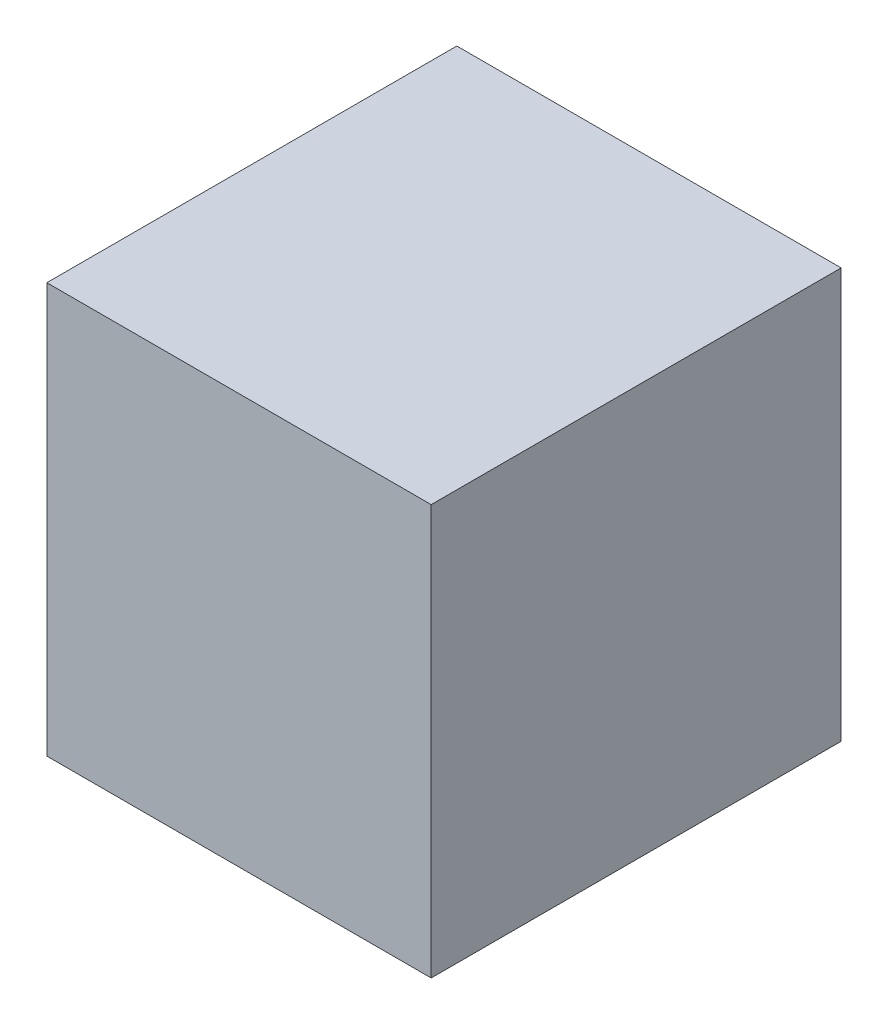
ISO-10303-21;
HEADER;
FILE_DESCRIPTION(('STEP AP214'),'2;1');
FILE_NAME('part.step','',(''),(''),'','','');
FILE_SCHEMA(('AUTOMOTIVE_DESIGN { 1 0 10303 214 1 1 1 1 }'));
ENDSEC;
DATA;
#1=APPLICATION_CONTEXT('core data for automotive mechanical design processes');
#2=APPLICATION_PROTOCOL_DEFINITION('international standard','automotive_design',2000,#1);
#3=PRODUCT_CONTEXT('',#1,'mechanical');
#4=PRODUCT('Part','Part','',(#3));
#5=PRODUCT_RELATED_PRODUCT_CATEGORY('part','',(#4));
#6=PRODUCT_DEFINITION_FORMATION('','',#4);
#7=PRODUCT_DEFINITION_CONTEXT('part definition',#1,'design');
#8=PRODUCT_DEFINITION('design','',#6,#7);
#9=PRODUCT_DEFINITION_SHAPE('','',#8);
#10=(LENGTH_UNIT() NAMED_UNIT(*) SI_UNIT(.MILLI.,.METRE.));
#11=(NAMED_UNIT(*) PLANE_ANGLE_UNIT() SI_UNIT($,.RADIAN.));
#12=(NAMED_UNIT(*) SI_UNIT($,.STERADIAN.) SOLID_ANGLE_UNIT());
#13=UNCERTAINTY_MEASURE_WITH_UNIT(LENGTH_MEASURE(1.E-05),#10,'distance_accuracy_value','');
#14=(GEOMETRIC_REPRESENTATION_CONTEXT(3) GLOBAL_UNCERTAINTY_ASSIGNED_CONTEXT((#13)) GLOBAL_UNIT_ASSIGNED_CONTEXT((#10,
#11,#12)) REPRESENTATION_CONTEXT('',''));
#15=CARTESIAN_POINT('',(0.,0.,0.));
#16=DIRECTION('',(0.,0.,1.));
#17=DIRECTION('',(1.,0.,0.));
#18=AXIS2_PLACEMENT_3D('',#15,#16,#17);
#19=CARTESIAN_POINT('',(143.,-8.,-8.));
#20=DIRECTION('',(-1.,0.,0.));
#21=DIRECTION('',(0.,0.,1.));
#22=AXIS2_PLACEMENT_3D('',#19,#20,#21);
#23=PLANE('',#22);
#24=DIRECTION('',(0.,-1.,0.));
#25=VECTOR('',#24,1.);
#26=CARTESIAN_POINT('',(143.,-8.,8.));
#27=LINE('',#26,#25);
#28=CARTESIAN_POINT('',(143.,8.,8.));
#29=VERTEX_POINT('',#28);
#30=CARTESIAN_POINT('',(143.,-8.,8.));
#31=VERTEX_POINT('',#30);
#32=EDGE_CURVE('E103',#29,#31,#27,.T.);
#33=ORIENTED_EDGE('',*,*,#32,.F.);
#34=DIRECTION('',(0.,0.,1.));
#35=VECTOR('',#34,1.);
#36=CARTESIAN_POINT('',(143.,8.,-8.));
#37=LINE('',#36,#35);
#38=CARTESIAN_POINT('',(143.,8.,-8.));
#39=VERTEX_POINT('',#38);
#40=EDGE_CURVE('E11',#39,#29,#37,.T.);
#41=ORIENTED_EDGE('',*,*,#40,.F.);
#42=DIRECTION('',(0.,-1.,0.));
#43=VECTOR('',#42,1.);
#44=CARTESIAN_POINT('',(143.,-8.,-8.));
#45=LINE('',#44,#43);
#46=CARTESIAN_POINT('',(143.,-8.,-8.));
#47=VERTEX_POINT('',#46);
#48=EDGE_CURVE('E97',#39,#47,#45,.T.);
#49=ORIENTED_EDGE('',*,*,#48,.T.);
#50=DIRECTION('',(0.,0.,1.));
#51=VECTOR('',#50,1.);
#52=CARTESIAN_POINT('',(143.,-8.,-8.));
#53=LINE('',#52,#51);
#54=EDGE_CURVE('E42',#47,#31,#53,.T.);
#55=ORIENTED_EDGE('',*,*,#54,.T.);
#56=EDGE_LOOP('',(#33,#41,#49,#55));
#57=FACE_BOUND('',#56,.T.);
#58=ADVANCED_FACE('F39',(#57),#23,.T.);
#59=CARTESIAN_POINT('',(143.,8.,-8.));
#60=DIRECTION('',(0.,1.,0.));
#61=DIRECTION('',(0.,0.,1.));
#62=AXIS2_PLACEMENT_3D('',#59,#60,#61);
#63=PLANE('',#62);
#64=DIRECTION('',(-1.,0.,0.));
#65=VECTOR('',#64,1.);
#66=CARTESIAN_POINT('',(143.,8.,8.));
#67=LINE('',#66,#65);
#68=CARTESIAN_POINT('',(158.,8.,8.));
#69=VERTEX_POINT('',#68);
#70=EDGE_CURVE('E99',#69,#29,#67,.T.);
#71=ORIENTED_EDGE('',*,*,#70,.F.);
#72=DIRECTION('',(0.,0.,1.));
#73=VECTOR('',#72,1.);
#74=CARTESIAN_POINT('',(158.,8.,-8.));
#75=LINE('',#74,#73);
#76=CARTESIAN_POINT('',(158.,8.,-8.));
#77=VERTEX_POINT('',#76);
#78=EDGE_CURVE('E48',#77,#69,#75,.T.);
#79=ORIENTED_EDGE('',*,*,#78,.F.);
#80=DIRECTION('',(-1.,0.,0.));
#81=VECTOR('',#80,1.);
#82=CARTESIAN_POINT('',(143.,8.,-8.));
#83=LINE('',#82,#81);
#84=EDGE_CURVE('E94',#77,#39,#83,.T.);
#85=ORIENTED_EDGE('',*,*,#84,.T.);
#86=ORIENTED_EDGE('',*,*,#40,.T.);
#87=EDGE_LOOP('',(#71,#79,#85,#86));
#88=FACE_BOUND('',#87,.T.);
#89=ADVANCED_FACE('F113',(#88),#63,.T.);
#90=CARTESIAN_POINT('',(158.,-8.,-8.));
#91=DIRECTION('',(1.,0.,0.));
#92=DIRECTION('',(0.,0.,-1.));
#93=AXIS2_PLACEMENT_3D('',#90,#91,#92);
#94=PLANE('',#93);
#95=DIRECTION('',(0.,1.,0.));
#96=VECTOR('',#95,1.);
#97=CARTESIAN_POINT('',(158.,-8.,8.));
#98=LINE('',#97,#96);
#99=CARTESIAN_POINT('',(158.,-8.,8.));
#100=VERTEX_POINT('',#99);
#101=EDGE_CURVE('E89',#100,#69,#98,.T.);
#102=ORIENTED_EDGE('',*,*,#101,.F.);
#103=DIRECTION('',(0.,0.,1.));
#104=VECTOR('',#103,1.);
#105=CARTESIAN_POINT('',(158.,-8.,-8.));
#106=LINE('',#105,#104);
#107=CARTESIAN_POINT('',(158.,-8.,-8.));
#108=VERTEX_POINT('',#107);
#109=EDGE_CURVE('E84',#108,#100,#106,.T.);
#110=ORIENTED_EDGE('',*,*,#109,.F.);
#111=DIRECTION('',(0.,1.,0.));
#112=VECTOR('',#111,1.);
#113=CARTESIAN_POINT('',(158.,-8.,-8.));
#114=LINE('',#113,#112);
#115=EDGE_CURVE('E87',#108,#77,#114,.T.);
#116=ORIENTED_EDGE('',*,*,#115,.T.);
#117=ORIENTED_EDGE('',*,*,#78,.T.);
#118=EDGE_LOOP('',(#102,#110,#116,#117));
#119=FACE_BOUND('',#118,.T.);
#120=ADVANCED_FACE('F86',(#119),#94,.T.);
#121=CARTESIAN_POINT('',(143.,-8.,-8.));
#122=DIRECTION('',(0.,-1.,0.));
#123=DIRECTION('',(0.,0.,-1.));
#124=AXIS2_PLACEMENT_3D('',#121,#122,#123);
#125=PLANE('',#124);
#126=DIRECTION('',(1.,0.,0.));
#127=VECTOR('',#126,1.);
#128=CARTESIAN_POINT('',(143.,-8.,8.));
#129=LINE('',#128,#127);
#130=EDGE_CURVE('E106',#31,#100,#129,.T.);
#131=ORIENTED_EDGE('',*,*,#130,.F.);
#132=ORIENTED_EDGE('',*,*,#54,.F.);
#133=DIRECTION('',(1.,0.,0.));
#134=VECTOR('',#133,1.);
#135=CARTESIAN_POINT('',(143.,-8.,-8.));
#136=LINE('',#135,#134);
#137=EDGE_CURVE('E93',#47,#108,#136,.T.);
#138=ORIENTED_EDGE('',*,*,#137,.T.);
#139=ORIENTED_EDGE('',*,*,#109,.T.);
#140=EDGE_LOOP('',(#131,#132,#138,#139));
#141=FACE_BOUND('',#140,.T.);
#142=ADVANCED_FACE('F96',(#141),#125,.T.);
#143=CARTESIAN_POINT('',(0.,0.,-8.));
#144=DIRECTION('',(0.,0.,-1.));
#145=DIRECTION('',(-1.,0.,0.));
#146=AXIS2_PLACEMENT_3D('',#143,#144,#145);
#147=PLANE('',#146);
#148=ORIENTED_EDGE('',*,*,#48,.F.);
#149=ORIENTED_EDGE('',*,*,#84,.F.);
#150=ORIENTED_EDGE('',*,*,#115,.F.);
#151=ORIENTED_EDGE('',*,*,#137,.F.);
#152=EDGE_LOOP('',(#148,#149,#150,#151));
#153=FACE_BOUND('',#152,.T.);
#154=ADVANCED_FACE('F92',(#153),#147,.T.);
#155=CARTESIAN_POINT('',(0.,0.,8.));
#156=DIRECTION('',(0.,0.,-1.));
#157=DIRECTION('',(-1.,0.,0.));
#158=AXIS2_PLACEMENT_3D('',#155,#156,#157);
#159=PLANE('',#158);
#160=ORIENTED_EDGE('',*,*,#32,.T.);
#161=ORIENTED_EDGE('',*,*,#130,.T.);
#162=ORIENTED_EDGE('',*,*,#101,.T.);
#163=ORIENTED_EDGE('',*,*,#70,.T.);
#164=EDGE_LOOP('',(#160,#161,#162,#163));
#165=FACE_BOUND('',#164,.T.);
#166=ADVANCED_FACE('F112',(#165),#159,.F.);
#167=CLOSED_SHELL('',(#58,#89,#120,#142,#154,#166));
#168=MANIFOLD_SOLID_BREP('B2',#167);
#169=ADVANCED_BREP_SHAPE_REPRESENTATION('',(#18,#168),#14);
#170=SHAPE_DEFINITION_REPRESENTATION(#9,#169);
ENDSEC;
END-ISO-10303-21;
